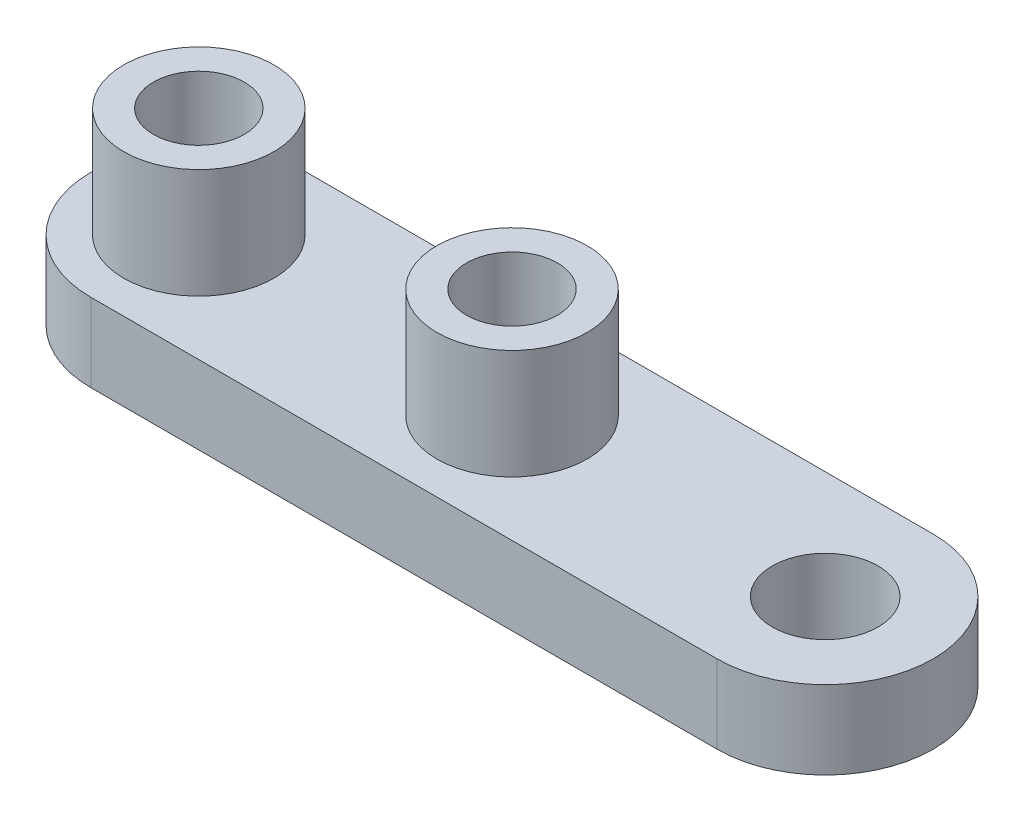
ISO-10303-21;
HEADER;
FILE_DESCRIPTION(('STEP AP214'),'2;1');
FILE_NAME('part.step','',(''),(''),'','','');
FILE_SCHEMA(('AUTOMOTIVE_DESIGN { 1 0 10303 214 1 1 1 1 }'));
ENDSEC;
DATA;
#1=APPLICATION_CONTEXT('core data for automotive mechanical design processes');
#2=APPLICATION_PROTOCOL_DEFINITION('international standard','automotive_design',2000,#1);
#3=PRODUCT_CONTEXT('',#1,'mechanical');
#4=PRODUCT('Part','Part','',(#3));
#5=PRODUCT_RELATED_PRODUCT_CATEGORY('part','',(#4));
#6=PRODUCT_DEFINITION_FORMATION('','',#4);
#7=PRODUCT_DEFINITION_CONTEXT('part definition',#1,'design');
#8=PRODUCT_DEFINITION('design','',#6,#7);
#9=PRODUCT_DEFINITION_SHAPE('','',#8);
#10=(LENGTH_UNIT() NAMED_UNIT(*) SI_UNIT(.MILLI.,.METRE.));
#11=(NAMED_UNIT(*) PLANE_ANGLE_UNIT() SI_UNIT($,.RADIAN.));
#12=(NAMED_UNIT(*) SI_UNIT($,.STERADIAN.) SOLID_ANGLE_UNIT());
#13=UNCERTAINTY_MEASURE_WITH_UNIT(LENGTH_MEASURE(1.E-05),#10,'distance_accuracy_value','');
#14=(GEOMETRIC_REPRESENTATION_CONTEXT(3) GLOBAL_UNCERTAINTY_ASSIGNED_CONTEXT((#13)) GLOBAL_UNIT_ASSIGNED_CONTEXT((#10,
#11,#12)) REPRESENTATION_CONTEXT('',''));
#15=CARTESIAN_POINT('',(0.,0.,0.));
#16=DIRECTION('',(0.,0.,1.));
#17=DIRECTION('',(1.,0.,0.));
#18=AXIS2_PLACEMENT_3D('',#15,#16,#17);
#19=CARTESIAN_POINT('',(0.,2.5,0.));
#20=DIRECTION('',(0.,1.,0.));
#21=DIRECTION('',(0.,0.,1.));
#22=AXIS2_PLACEMENT_3D('',#19,#20,#21);
#23=PLANE('',#22);
#24=CARTESIAN_POINT('',(20.,2.5,0.));
#25=DIRECTION('',(0.,1.,0.));
#26=DIRECTION('',(0.,0.,1.));
#27=AXIS2_PLACEMENT_3D('',#24,#25,#26);
#28=CIRCLE('',#27,1.69);
#29=CARTESIAN_POINT('',(20.,2.5,1.69));
#30=VERTEX_POINT('',#29);
#31=EDGE_CURVE('E142',#30,#30,#28,.T.);
#32=ORIENTED_EDGE('',*,*,#31,.F.);
#33=EDGE_LOOP('',(#32));
#34=FACE_BOUND('',#33,.T.);
#35=CARTESIAN_POINT('',(10.,2.5,0.));
#36=DIRECTION('',(0.,1.,0.));
#37=DIRECTION('',(0.,0.,1.));
#38=AXIS2_PLACEMENT_3D('',#35,#36,#37);
#39=CIRCLE('',#38,2.4);
#40=CARTESIAN_POINT('',(10.,2.5,2.4));
#41=VERTEX_POINT('',#40);
#42=EDGE_CURVE('E128',#41,#41,#39,.T.);
#43=ORIENTED_EDGE('',*,*,#42,.F.);
#44=EDGE_LOOP('',(#43));
#45=FACE_BOUND('',#44,.T.);
#46=CARTESIAN_POINT('',(0.,2.5,0.));
#47=DIRECTION('',(0.,1.,0.));
#48=DIRECTION('',(0.,0.,1.));
#49=AXIS2_PLACEMENT_3D('',#46,#47,#48);
#50=CIRCLE('',#49,3.45);
#51=CARTESIAN_POINT('',(0.,2.5,-3.45));
#52=VERTEX_POINT('',#51);
#53=CARTESIAN_POINT('',(0.,2.5,3.45));
#54=VERTEX_POINT('',#53);
#55=EDGE_CURVE('E91',#52,#54,#50,.T.);
#56=ORIENTED_EDGE('',*,*,#55,.T.);
#57=DIRECTION('',(1.,0.,0.));
#58=VECTOR('',#57,1.);
#59=CARTESIAN_POINT('',(0.,2.5,3.45));
#60=LINE('',#59,#58);
#61=CARTESIAN_POINT('',(20.,2.5,3.45));
#62=VERTEX_POINT('',#61);
#63=EDGE_CURVE('E86',#54,#62,#60,.T.);
#64=ORIENTED_EDGE('',*,*,#63,.T.);
#65=CARTESIAN_POINT('',(20.,2.5,0.));
#66=DIRECTION('',(0.,1.,0.));
#67=DIRECTION('',(0.,0.,1.));
#68=AXIS2_PLACEMENT_3D('',#65,#66,#67);
#69=CIRCLE('',#68,3.45);
#70=CARTESIAN_POINT('',(20.,2.5,-3.45));
#71=VERTEX_POINT('',#70);
#72=EDGE_CURVE('E89',#62,#71,#69,.T.);
#73=ORIENTED_EDGE('',*,*,#72,.T.);
#74=DIRECTION('',(-1.,0.,0.));
#75=VECTOR('',#74,1.);
#76=CARTESIAN_POINT('',(0.,2.5,-3.45));
#77=LINE('',#76,#75);
#78=EDGE_CURVE('E56',#71,#52,#77,.T.);
#79=ORIENTED_EDGE('',*,*,#78,.T.);
#80=EDGE_LOOP('',(#56,#64,#73,#79));
#81=FACE_BOUND('',#80,.T.);
#82=CARTESIAN_POINT('',(0.,2.5,0.));
#83=DIRECTION('',(0.,1.,0.));
#84=DIRECTION('',(0.,0.,1.));
#85=AXIS2_PLACEMENT_3D('',#82,#83,#84);
#86=CIRCLE('',#85,2.4);
#87=CARTESIAN_POINT('',(0.,2.5,2.4));
#88=VERTEX_POINT('',#87);
#89=EDGE_CURVE('E135',#88,#88,#86,.T.);
#90=ORIENTED_EDGE('',*,*,#89,.F.);
#91=EDGE_LOOP('',(#90));
#92=FACE_BOUND('',#91,.T.);
#93=ADVANCED_FACE('F39',(#34,#45,#81,#92),#23,.T.);
#94=CARTESIAN_POINT('',(0.,0.,0.));
#95=DIRECTION('',(0.,1.,0.));
#96=DIRECTION('',(0.,0.,1.));
#97=AXIS2_PLACEMENT_3D('',#94,#95,#96);
#98=PLANE('',#97);
#99=CARTESIAN_POINT('',(20.,0.,0.));
#100=DIRECTION('',(0.,1.,0.));
#101=DIRECTION('',(0.,0.,1.));
#102=AXIS2_PLACEMENT_3D('',#99,#100,#101);
#103=CIRCLE('',#102,1.69);
#104=CARTESIAN_POINT('',(20.,0.,1.69));
#105=VERTEX_POINT('',#104);
#106=EDGE_CURVE('E132',#105,#105,#103,.T.);
#107=ORIENTED_EDGE('',*,*,#106,.T.);
#108=EDGE_LOOP('',(#107));
#109=FACE_BOUND('',#108,.T.);
#110=CARTESIAN_POINT('',(0.,0.,0.));
#111=DIRECTION('',(0.,1.,0.));
#112=DIRECTION('',(0.,0.,1.));
#113=AXIS2_PLACEMENT_3D('',#110,#111,#112);
#114=CIRCLE('',#113,3.45);
#115=CARTESIAN_POINT('',(0.,0.,-3.45));
#116=VERTEX_POINT('',#115);
#117=CARTESIAN_POINT('',(0.,0.,3.45));
#118=VERTEX_POINT('',#117);
#119=EDGE_CURVE('E103',#116,#118,#114,.T.);
#120=ORIENTED_EDGE('',*,*,#119,.F.);
#121=DIRECTION('',(-1.,0.,0.));
#122=VECTOR('',#121,1.);
#123=CARTESIAN_POINT('',(0.,0.,-3.45));
#124=LINE('',#123,#122);
#125=CARTESIAN_POINT('',(20.,0.,-3.45));
#126=VERTEX_POINT('',#125);
#127=EDGE_CURVE('E79',#126,#116,#124,.T.);
#128=ORIENTED_EDGE('',*,*,#127,.F.);
#129=CARTESIAN_POINT('',(20.,0.,0.));
#130=DIRECTION('',(0.,1.,0.));
#131=DIRECTION('',(0.,0.,1.));
#132=AXIS2_PLACEMENT_3D('',#129,#130,#131);
#133=CIRCLE('',#132,3.45);
#134=CARTESIAN_POINT('',(20.,0.,3.45));
#135=VERTEX_POINT('',#134);
#136=EDGE_CURVE('E73',#135,#126,#133,.T.);
#137=ORIENTED_EDGE('',*,*,#136,.F.);
#138=DIRECTION('',(1.,0.,0.));
#139=VECTOR('',#138,1.);
#140=CARTESIAN_POINT('',(0.,0.,3.45));
#141=LINE('',#140,#139);
#142=EDGE_CURVE('E95',#118,#135,#141,.T.);
#143=ORIENTED_EDGE('',*,*,#142,.F.);
#144=EDGE_LOOP('',(#120,#128,#137,#143));
#145=FACE_BOUND('',#144,.T.);
#146=CARTESIAN_POINT('',(0.,0.,0.));
#147=DIRECTION('',(0.,1.,0.));
#148=DIRECTION('',(0.,0.,1.));
#149=AXIS2_PLACEMENT_3D('',#146,#147,#148);
#150=CIRCLE('',#149,1.45);
#151=CARTESIAN_POINT('',(0.,0.,1.45));
#152=VERTEX_POINT('',#151);
#153=EDGE_CURVE('E106',#152,#152,#150,.T.);
#154=ORIENTED_EDGE('',*,*,#153,.T.);
#155=EDGE_LOOP('',(#154));
#156=FACE_BOUND('',#155,.T.);
#157=CARTESIAN_POINT('',(10.,0.,0.));
#158=DIRECTION('',(0.,1.,0.));
#159=DIRECTION('',(0.,0.,1.));
#160=AXIS2_PLACEMENT_3D('',#157,#158,#159);
#161=CIRCLE('',#160,1.45);
#162=CARTESIAN_POINT('',(10.,0.,1.45));
#163=VERTEX_POINT('',#162);
#164=EDGE_CURVE('E120',#163,#163,#161,.T.);
#165=ORIENTED_EDGE('',*,*,#164,.T.);
#166=EDGE_LOOP('',(#165));
#167=FACE_BOUND('',#166,.T.);
#168=ADVANCED_FACE('F114',(#109,#145,#156,#167),#98,.F.);
#169=CARTESIAN_POINT('',(0.,2.5,0.));
#170=DIRECTION('',(0.,-1.,0.));
#171=DIRECTION('',(0.,0.,-1.));
#172=AXIS2_PLACEMENT_3D('',#169,#170,#171);
#173=CYLINDRICAL_SURFACE('',#172,3.45);
#174=ORIENTED_EDGE('',*,*,#119,.T.);
#175=DIRECTION('',(0.,-1.,0.));
#176=VECTOR('',#175,1.);
#177=CARTESIAN_POINT('',(0.,2.5,3.45));
#178=LINE('',#177,#176);
#179=EDGE_CURVE('E11',#54,#118,#178,.T.);
#180=ORIENTED_EDGE('',*,*,#179,.F.);
#181=ORIENTED_EDGE('',*,*,#55,.F.);
#182=DIRECTION('',(0.,-1.,0.));
#183=VECTOR('',#182,1.);
#184=CARTESIAN_POINT('',(0.,2.5,-3.45));
#185=LINE('',#184,#183);
#186=EDGE_CURVE('E99',#52,#116,#185,.T.);
#187=ORIENTED_EDGE('',*,*,#186,.T.);
#188=EDGE_LOOP('',(#174,#180,#181,#187));
#189=FACE_BOUND('',#188,.T.);
#190=ADVANCED_FACE('F41',(#189),#173,.T.);
#191=CARTESIAN_POINT('',(0.,2.5,3.45));
#192=DIRECTION('',(0.,0.,-1.));
#193=DIRECTION('',(-1.,0.,0.));
#194=AXIS2_PLACEMENT_3D('',#191,#192,#193);
#195=PLANE('',#194);
#196=ORIENTED_EDGE('',*,*,#142,.T.);
#197=DIRECTION('',(0.,-1.,0.));
#198=VECTOR('',#197,1.);
#199=CARTESIAN_POINT('',(20.,2.5,3.45));
#200=LINE('',#199,#198);
#201=EDGE_CURVE('E48',#62,#135,#200,.T.);
#202=ORIENTED_EDGE('',*,*,#201,.F.);
#203=ORIENTED_EDGE('',*,*,#63,.F.);
#204=ORIENTED_EDGE('',*,*,#179,.T.);
#205=EDGE_LOOP('',(#196,#202,#203,#204));
#206=FACE_BOUND('',#205,.T.);
#207=ADVANCED_FACE('F94',(#206),#195,.F.);
#208=CARTESIAN_POINT('',(20.,2.5,0.));
#209=DIRECTION('',(0.,-1.,0.));
#210=DIRECTION('',(0.,0.,-1.));
#211=AXIS2_PLACEMENT_3D('',#208,#209,#210);
#212=CYLINDRICAL_SURFACE('',#211,3.45);
#213=ORIENTED_EDGE('',*,*,#136,.T.);
#214=DIRECTION('',(0.,-1.,0.));
#215=VECTOR('',#214,1.);
#216=CARTESIAN_POINT('',(20.,2.5,-3.45));
#217=LINE('',#216,#215);
#218=EDGE_CURVE('E96',#71,#126,#217,.T.);
#219=ORIENTED_EDGE('',*,*,#218,.F.);
#220=ORIENTED_EDGE('',*,*,#72,.F.);
#221=ORIENTED_EDGE('',*,*,#201,.T.);
#222=EDGE_LOOP('',(#213,#219,#220,#221));
#223=FACE_BOUND('',#222,.T.);
#224=ADVANCED_FACE('F97',(#223),#212,.T.);
#225=CARTESIAN_POINT('',(0.,2.5,-3.45));
#226=DIRECTION('',(0.,0.,1.));
#227=DIRECTION('',(1.,0.,0.));
#228=AXIS2_PLACEMENT_3D('',#225,#226,#227);
#229=PLANE('',#228);
#230=ORIENTED_EDGE('',*,*,#127,.T.);
#231=ORIENTED_EDGE('',*,*,#186,.F.);
#232=ORIENTED_EDGE('',*,*,#78,.F.);
#233=ORIENTED_EDGE('',*,*,#218,.T.);
#234=EDGE_LOOP('',(#230,#231,#232,#233));
#235=FACE_BOUND('',#234,.T.);
#236=ADVANCED_FACE('F111',(#235),#229,.F.);
#237=CARTESIAN_POINT('',(0.,2.5,0.));
#238=DIRECTION('',(0.,-1.,0.));
#239=DIRECTION('',(0.,0.,-1.));
#240=AXIS2_PLACEMENT_3D('',#237,#238,#239);
#241=CYLINDRICAL_SURFACE('',#240,1.45);
#242=ORIENTED_EDGE('',*,*,#153,.F.);
#243=EDGE_LOOP('',(#242));
#244=FACE_BOUND('',#243,.T.);
#245=CARTESIAN_POINT('',(0.,6.,0.));
#246=DIRECTION('',(0.,1.,0.));
#247=DIRECTION('',(0.,0.,1.));
#248=AXIS2_PLACEMENT_3D('',#245,#246,#247);
#249=CIRCLE('',#248,1.45);
#250=CARTESIAN_POINT('',(0.,6.,1.45));
#251=VERTEX_POINT('',#250);
#252=EDGE_CURVE('E127',#251,#251,#249,.T.);
#253=ORIENTED_EDGE('',*,*,#252,.T.);
#254=EDGE_LOOP('',(#253));
#255=FACE_BOUND('',#254,.T.);
#256=ADVANCED_FACE('F181',(#244,#255),#241,.F.);
#257=CARTESIAN_POINT('',(10.,2.5,0.));
#258=DIRECTION('',(0.,-1.,0.));
#259=DIRECTION('',(0.,0.,-1.));
#260=AXIS2_PLACEMENT_3D('',#257,#258,#259);
#261=CYLINDRICAL_SURFACE('',#260,1.45);
#262=ORIENTED_EDGE('',*,*,#164,.F.);
#263=EDGE_LOOP('',(#262));
#264=FACE_BOUND('',#263,.T.);
#265=CARTESIAN_POINT('',(10.,6.,0.));
#266=DIRECTION('',(0.,1.,0.));
#267=DIRECTION('',(0.,0.,1.));
#268=AXIS2_PLACEMENT_3D('',#265,#266,#267);
#269=CIRCLE('',#268,1.45);
#270=CARTESIAN_POINT('',(10.,6.,1.45));
#271=VERTEX_POINT('',#270);
#272=EDGE_CURVE('E124',#271,#271,#269,.T.);
#273=ORIENTED_EDGE('',*,*,#272,.T.);
#274=EDGE_LOOP('',(#273));
#275=FACE_BOUND('',#274,.T.);
#276=ADVANCED_FACE('F173',(#264,#275),#261,.F.);
#277=CARTESIAN_POINT('',(10.,6.,0.));
#278=DIRECTION('',(0.,1.,0.));
#279=DIRECTION('',(0.,0.,1.));
#280=AXIS2_PLACEMENT_3D('',#277,#278,#279);
#281=PLANE('',#280);
#282=CARTESIAN_POINT('',(10.,6.,0.));
#283=DIRECTION('',(0.,1.,0.));
#284=DIRECTION('',(0.,0.,1.));
#285=AXIS2_PLACEMENT_3D('',#282,#283,#284);
#286=CIRCLE('',#285,2.4);
#287=CARTESIAN_POINT('',(10.,6.,2.4));
#288=VERTEX_POINT('',#287);
#289=EDGE_CURVE('E129',#288,#288,#286,.T.);
#290=ORIENTED_EDGE('',*,*,#289,.T.);
#291=EDGE_LOOP('',(#290));
#292=FACE_BOUND('',#291,.T.);
#293=ORIENTED_EDGE('',*,*,#272,.F.);
#294=EDGE_LOOP('',(#293));
#295=FACE_BOUND('',#294,.T.);
#296=ADVANCED_FACE('F164',(#292,#295),#281,.T.);
#297=CARTESIAN_POINT('',(10.,6.,0.));
#298=DIRECTION('',(0.,-1.,0.));
#299=DIRECTION('',(0.,0.,-1.));
#300=AXIS2_PLACEMENT_3D('',#297,#298,#299);
#301=CYLINDRICAL_SURFACE('',#300,2.4);
#302=ORIENTED_EDGE('',*,*,#289,.F.);
#303=EDGE_LOOP('',(#302));
#304=FACE_BOUND('',#303,.T.);
#305=ORIENTED_EDGE('',*,*,#42,.T.);
#306=EDGE_LOOP('',(#305));
#307=FACE_BOUND('',#306,.T.);
#308=ADVANCED_FACE('F161',(#304,#307),#301,.T.);
#309=CARTESIAN_POINT('',(0.,6.,0.));
#310=DIRECTION('',(0.,1.,0.));
#311=DIRECTION('',(0.,0.,1.));
#312=AXIS2_PLACEMENT_3D('',#309,#310,#311);
#313=PLANE('',#312);
#314=CARTESIAN_POINT('',(0.,6.,0.));
#315=DIRECTION('',(0.,1.,0.));
#316=DIRECTION('',(0.,0.,1.));
#317=AXIS2_PLACEMENT_3D('',#314,#315,#316);
#318=CIRCLE('',#317,2.4);
#319=CARTESIAN_POINT('',(0.,6.,2.4));
#320=VERTEX_POINT('',#319);
#321=EDGE_CURVE('E123',#320,#320,#318,.T.);
#322=ORIENTED_EDGE('',*,*,#321,.T.);
#323=EDGE_LOOP('',(#322));
#324=FACE_BOUND('',#323,.T.);
#325=ORIENTED_EDGE('',*,*,#252,.F.);
#326=EDGE_LOOP('',(#325));
#327=FACE_BOUND('',#326,.T.);
#328=ADVANCED_FACE('F163',(#324,#327),#313,.T.);
#329=CARTESIAN_POINT('',(0.,6.,0.));
#330=DIRECTION('',(0.,-1.,0.));
#331=DIRECTION('',(0.,0.,-1.));
#332=AXIS2_PLACEMENT_3D('',#329,#330,#331);
#333=CYLINDRICAL_SURFACE('',#332,2.4);
#334=ORIENTED_EDGE('',*,*,#321,.F.);
#335=EDGE_LOOP('',(#334));
#336=FACE_BOUND('',#335,.T.);
#337=ORIENTED_EDGE('',*,*,#89,.T.);
#338=EDGE_LOOP('',(#337));
#339=FACE_BOUND('',#338,.T.);
#340=ADVANCED_FACE('F152',(#336,#339),#333,.T.);
#341=CARTESIAN_POINT('',(20.,0.,0.));
#342=DIRECTION('',(0.,1.,0.));
#343=DIRECTION('',(0.,0.,1.));
#344=AXIS2_PLACEMENT_3D('',#341,#342,#343);
#345=CYLINDRICAL_SURFACE('',#344,1.69);
#346=ORIENTED_EDGE('',*,*,#106,.F.);
#347=EDGE_LOOP('',(#346));
#348=FACE_BOUND('',#347,.T.);
#349=ORIENTED_EDGE('',*,*,#31,.T.);
#350=EDGE_LOOP('',(#349));
#351=FACE_BOUND('',#350,.T.);
#352=ADVANCED_FACE('F149',(#348,#351),#345,.F.);
#353=CLOSED_SHELL('',(#93,#168,#190,#207,#224,#236,#256,#276,#296,#308,#328,#340,#352));
#354=MANIFOLD_SOLID_BREP('B2',#353);
#355=ADVANCED_BREP_SHAPE_REPRESENTATION('',(#18,#354),#14);
#356=SHAPE_DEFINITION_REPRESENTATION(#9,#355);
ENDSEC;
END-ISO-10303-21;
